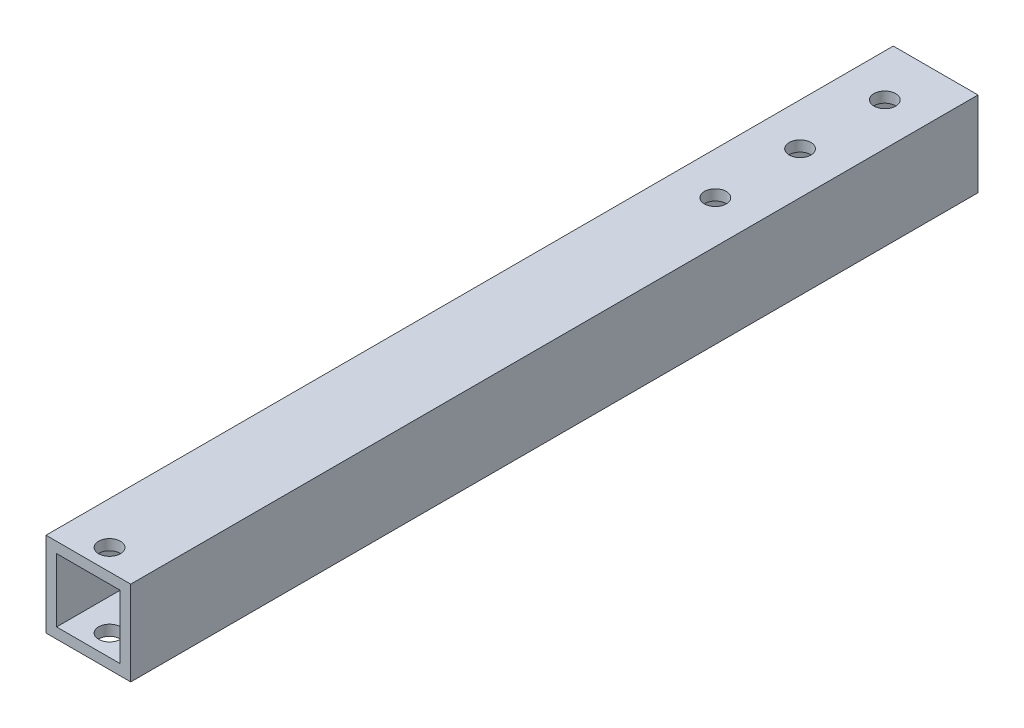
ISO-10303-21;
HEADER;
FILE_DESCRIPTION(('STEP AP214'),'2;1');
FILE_NAME('part.step','',(''),(''),'','','');
FILE_SCHEMA(('AUTOMOTIVE_DESIGN { 1 0 10303 214 1 1 1 1 }'));
ENDSEC;
DATA;
#1=APPLICATION_CONTEXT('core data for automotive mechanical design processes');
#2=APPLICATION_PROTOCOL_DEFINITION('international standard','automotive_design',2000,#1);
#3=PRODUCT_CONTEXT('',#1,'mechanical');
#4=PRODUCT('Part','Part','',(#3));
#5=PRODUCT_RELATED_PRODUCT_CATEGORY('part','',(#4));
#6=PRODUCT_DEFINITION_FORMATION('','',#4);
#7=PRODUCT_DEFINITION_CONTEXT('part definition',#1,'design');
#8=PRODUCT_DEFINITION('design','',#6,#7);
#9=PRODUCT_DEFINITION_SHAPE('','',#8);
#10=(LENGTH_UNIT() NAMED_UNIT(*) SI_UNIT(.MILLI.,.METRE.));
#11=(NAMED_UNIT(*) PLANE_ANGLE_UNIT() SI_UNIT($,.RADIAN.));
#12=(NAMED_UNIT(*) SI_UNIT($,.STERADIAN.) SOLID_ANGLE_UNIT());
#13=UNCERTAINTY_MEASURE_WITH_UNIT(LENGTH_MEASURE(1.E-05),#10,'distance_accuracy_value','');
#14=(GEOMETRIC_REPRESENTATION_CONTEXT(3) GLOBAL_UNCERTAINTY_ASSIGNED_CONTEXT((#13)) GLOBAL_UNIT_ASSIGNED_CONTEXT((#10,
#11,#12)) REPRESENTATION_CONTEXT('',''));
#15=CARTESIAN_POINT('',(0.,0.,0.));
#16=DIRECTION('',(0.,0.,1.));
#17=DIRECTION('',(1.,0.,0.));
#18=AXIS2_PLACEMENT_3D('',#15,#16,#17);
#19=CARTESIAN_POINT('',(0.,0.,254.));
#20=DIRECTION('',(0.,0.,-1.));
#21=DIRECTION('',(-1.,0.,0.));
#22=AXIS2_PLACEMENT_3D('',#19,#20,#21);
#23=PLANE('',#22);
#24=DIRECTION('',(-1.,0.,0.));
#25=VECTOR('',#24,1.);
#26=CARTESIAN_POINT('',(12.7000000000001,-12.7,254.));
#27=LINE('',#26,#25);
#28=CARTESIAN_POINT('',(12.7000000000001,-12.7,254.));
#29=VERTEX_POINT('',#28);
#30=CARTESIAN_POINT('',(-12.6999999999999,-12.7,254.));
#31=VERTEX_POINT('',#30);
#32=EDGE_CURVE('E140',#29,#31,#27,.T.);
#33=ORIENTED_EDGE('',*,*,#32,.F.);
#34=DIRECTION('',(0.,1.,0.));
#35=VECTOR('',#34,1.);
#36=CARTESIAN_POINT('',(12.7000000000001,-12.7,254.));
#37=LINE('',#36,#35);
#38=CARTESIAN_POINT('',(12.7000000000001,12.7,254.));
#39=VERTEX_POINT('',#38);
#40=EDGE_CURVE('E149',#29,#39,#37,.T.);
#41=ORIENTED_EDGE('',*,*,#40,.T.);
#42=DIRECTION('',(-1.,0.,0.));
#43=VECTOR('',#42,1.);
#44=CARTESIAN_POINT('',(12.7000000000001,12.7,254.));
#45=LINE('',#44,#43);
#46=CARTESIAN_POINT('',(-12.6999999999999,12.7,254.));
#47=VERTEX_POINT('',#46);
#48=EDGE_CURVE('E147',#39,#47,#45,.T.);
#49=ORIENTED_EDGE('',*,*,#48,.T.);
#50=DIRECTION('',(0.,1.,0.));
#51=VECTOR('',#50,1.);
#52=CARTESIAN_POINT('',(-12.6999999999999,-12.7,254.));
#53=LINE('',#52,#51);
#54=EDGE_CURVE('E143',#31,#47,#53,.T.);
#55=ORIENTED_EDGE('',*,*,#54,.F.);
#56=EDGE_LOOP('',(#33,#41,#49,#55));
#57=FACE_BOUND('',#56,.T.);
#58=DIRECTION('',(0.,1.,0.));
#59=VECTOR('',#58,1.);
#60=CARTESIAN_POINT('',(9.52500000000005,-9.52499999999999,254.));
#61=LINE('',#60,#59);
#62=CARTESIAN_POINT('',(9.52500000000005,-9.52499999999999,254.));
#63=VERTEX_POINT('',#62);
#64=CARTESIAN_POINT('',(9.52500000000005,9.52499999999999,254.));
#65=VERTEX_POINT('',#64);
#66=EDGE_CURVE('E102',#63,#65,#61,.T.);
#67=ORIENTED_EDGE('',*,*,#66,.F.);
#68=DIRECTION('',(1.,0.,0.));
#69=VECTOR('',#68,1.);
#70=CARTESIAN_POINT('',(-9.52500000000006,-9.52499999999999,254.));
#71=LINE('',#70,#69);
#72=CARTESIAN_POINT('',(-9.52500000000006,-9.52499999999999,254.));
#73=VERTEX_POINT('',#72);
#74=EDGE_CURVE('E124',#73,#63,#71,.T.);
#75=ORIENTED_EDGE('',*,*,#74,.F.);
#76=DIRECTION('',(0.,-1.,0.));
#77=VECTOR('',#76,1.);
#78=CARTESIAN_POINT('',(-9.52500000000006,-9.52499999999999,254.));
#79=LINE('',#78,#77);
#80=CARTESIAN_POINT('',(-9.52500000000006,9.52499999999999,254.));
#81=VERTEX_POINT('',#80);
#82=EDGE_CURVE('E122',#81,#73,#79,.T.);
#83=ORIENTED_EDGE('',*,*,#82,.F.);
#84=DIRECTION('',(-1.,0.,0.));
#85=VECTOR('',#84,1.);
#86=CARTESIAN_POINT('',(-9.52500000000006,9.52499999999999,254.));
#87=LINE('',#86,#85);
#88=EDGE_CURVE('E110',#65,#81,#87,.T.);
#89=ORIENTED_EDGE('',*,*,#88,.F.);
#90=EDGE_LOOP('',(#67,#75,#83,#89));
#91=FACE_BOUND('',#90,.T.);
#92=ADVANCED_FACE('F36',(#57,#91),#23,.F.);
#93=CARTESIAN_POINT('',(0.,0.,0.));
#94=DIRECTION('',(0.,0.,-1.));
#95=DIRECTION('',(-1.,0.,0.));
#96=AXIS2_PLACEMENT_3D('',#93,#94,#95);
#97=PLANE('',#96);
#98=DIRECTION('',(-1.,0.,0.));
#99=VECTOR('',#98,1.);
#100=CARTESIAN_POINT('',(12.7000000000001,-12.7,0.));
#101=LINE('',#100,#99);
#102=CARTESIAN_POINT('',(12.7000000000001,-12.7,0.));
#103=VERTEX_POINT('',#102);
#104=CARTESIAN_POINT('',(-12.6999999999999,-12.7,0.));
#105=VERTEX_POINT('',#104);
#106=EDGE_CURVE('E118',#103,#105,#101,.T.);
#107=ORIENTED_EDGE('',*,*,#106,.T.);
#108=DIRECTION('',(0.,1.,0.));
#109=VECTOR('',#108,1.);
#110=CARTESIAN_POINT('',(-12.6999999999999,-12.7,0.));
#111=LINE('',#110,#109);
#112=CARTESIAN_POINT('',(-12.6999999999999,12.7,0.));
#113=VERTEX_POINT('',#112);
#114=EDGE_CURVE('E154',#105,#113,#111,.T.);
#115=ORIENTED_EDGE('',*,*,#114,.T.);
#116=DIRECTION('',(-1.,0.,0.));
#117=VECTOR('',#116,1.);
#118=CARTESIAN_POINT('',(12.7000000000001,12.7,0.));
#119=LINE('',#118,#117);
#120=CARTESIAN_POINT('',(12.7000000000001,12.7,0.));
#121=VERTEX_POINT('',#120);
#122=EDGE_CURVE('E157',#121,#113,#119,.T.);
#123=ORIENTED_EDGE('',*,*,#122,.F.);
#124=DIRECTION('',(0.,1.,0.));
#125=VECTOR('',#124,1.);
#126=CARTESIAN_POINT('',(12.7000000000001,-12.7,0.));
#127=LINE('',#126,#125);
#128=EDGE_CURVE('E144',#103,#121,#127,.T.);
#129=ORIENTED_EDGE('',*,*,#128,.F.);
#130=EDGE_LOOP('',(#107,#115,#123,#129));
#131=FACE_BOUND('',#130,.T.);
#132=DIRECTION('',(1.,0.,0.));
#133=VECTOR('',#132,1.);
#134=CARTESIAN_POINT('',(-9.52500000000006,-9.52499999999999,0.));
#135=LINE('',#134,#133);
#136=CARTESIAN_POINT('',(-9.52500000000006,-9.52499999999999,0.));
#137=VERTEX_POINT('',#136);
#138=CARTESIAN_POINT('',(9.52500000000005,-9.52499999999999,0.));
#139=VERTEX_POINT('',#138);
#140=EDGE_CURVE('E111',#137,#139,#135,.T.);
#141=ORIENTED_EDGE('',*,*,#140,.T.);
#142=DIRECTION('',(0.,1.,0.));
#143=VECTOR('',#142,1.);
#144=CARTESIAN_POINT('',(9.52500000000005,-9.52499999999999,0.));
#145=LINE('',#144,#143);
#146=CARTESIAN_POINT('',(9.52500000000005,9.52499999999999,0.));
#147=VERTEX_POINT('',#146);
#148=EDGE_CURVE('E61',#139,#147,#145,.T.);
#149=ORIENTED_EDGE('',*,*,#148,.T.);
#150=DIRECTION('',(-1.,0.,0.));
#151=VECTOR('',#150,1.);
#152=CARTESIAN_POINT('',(-9.52500000000006,9.52499999999999,0.));
#153=LINE('',#152,#151);
#154=CARTESIAN_POINT('',(-9.52500000000006,9.52499999999999,0.));
#155=VERTEX_POINT('',#154);
#156=EDGE_CURVE('E117',#147,#155,#153,.T.);
#157=ORIENTED_EDGE('',*,*,#156,.T.);
#158=DIRECTION('',(0.,-1.,0.));
#159=VECTOR('',#158,1.);
#160=CARTESIAN_POINT('',(-9.52500000000006,-9.52499999999999,0.));
#161=LINE('',#160,#159);
#162=EDGE_CURVE('E132',#155,#137,#161,.T.);
#163=ORIENTED_EDGE('',*,*,#162,.T.);
#164=EDGE_LOOP('',(#141,#149,#157,#163));
#165=FACE_BOUND('',#164,.T.);
#166=ADVANCED_FACE('F219',(#131,#165),#97,.T.);
#167=CARTESIAN_POINT('',(12.7000000000001,-12.7,254.));
#168=DIRECTION('',(0.,-1.,0.));
#169=DIRECTION('',(0.,0.,-1.));
#170=AXIS2_PLACEMENT_3D('',#167,#168,#169);
#171=PLANE('',#170);
#172=CARTESIAN_POINT('',(0.,-12.7,66.04));
#173=DIRECTION('',(0.,1.,0.));
#174=DIRECTION('',(0.,0.,1.));
#175=AXIS2_PLACEMENT_3D('',#172,#173,#174);
#176=CIRCLE('',#175,3.26389999999999);
#177=CARTESIAN_POINT('',(0.,-12.7,69.3039));
#178=VERTEX_POINT('',#177);
#179=EDGE_CURVE('E178',#178,#178,#176,.T.);
#180=ORIENTED_EDGE('',*,*,#179,.T.);
#181=EDGE_LOOP('',(#180));
#182=FACE_BOUND('',#181,.T.);
#183=CARTESIAN_POINT('',(0.,-12.7,40.64));
#184=DIRECTION('',(0.,1.,0.));
#185=DIRECTION('',(0.,0.,1.));
#186=AXIS2_PLACEMENT_3D('',#183,#184,#185);
#187=CIRCLE('',#186,3.2639);
#188=CARTESIAN_POINT('',(0.,-12.7,43.9039));
#189=VERTEX_POINT('',#188);
#190=EDGE_CURVE('E189',#189,#189,#187,.T.);
#191=ORIENTED_EDGE('',*,*,#190,.T.);
#192=EDGE_LOOP('',(#191));
#193=FACE_BOUND('',#192,.T.);
#194=CARTESIAN_POINT('',(0.,-12.7,247.65));
#195=DIRECTION('',(0.,1.,0.));
#196=DIRECTION('',(0.,0.,1.));
#197=AXIS2_PLACEMENT_3D('',#194,#195,#196);
#198=CIRCLE('',#197,3.2639);
#199=CARTESIAN_POINT('',(0.,-12.7,250.9139));
#200=VERTEX_POINT('',#199);
#201=EDGE_CURVE('E174',#200,#200,#198,.T.);
#202=ORIENTED_EDGE('',*,*,#201,.T.);
#203=EDGE_LOOP('',(#202));
#204=FACE_BOUND('',#203,.T.);
#205=CARTESIAN_POINT('',(0.,-12.7,15.24));
#206=DIRECTION('',(0.,-1.,0.));
#207=DIRECTION('',(0.,0.,-1.));
#208=AXIS2_PLACEMENT_3D('',#205,#206,#207);
#209=CIRCLE('',#208,3.2639);
#210=CARTESIAN_POINT('',(0.,-12.7,18.5039));
#211=VERTEX_POINT('',#210);
#212=EDGE_CURVE('E130',#211,#211,#209,.T.);
#213=ORIENTED_EDGE('',*,*,#212,.F.);
#214=EDGE_LOOP('',(#213));
#215=FACE_BOUND('',#214,.T.);
#216=ORIENTED_EDGE('',*,*,#106,.F.);
#217=DIRECTION('',(0.,0.,-1.));
#218=VECTOR('',#217,1.);
#219=CARTESIAN_POINT('',(12.7000000000001,-12.7,254.));
#220=LINE('',#219,#218);
#221=EDGE_CURVE('E11',#29,#103,#220,.T.);
#222=ORIENTED_EDGE('',*,*,#221,.F.);
#223=ORIENTED_EDGE('',*,*,#32,.T.);
#224=DIRECTION('',(0.,0.,-1.));
#225=VECTOR('',#224,1.);
#226=CARTESIAN_POINT('',(-12.6999999999999,-12.7,254.));
#227=LINE('',#226,#225);
#228=EDGE_CURVE('E151',#31,#105,#227,.T.);
#229=ORIENTED_EDGE('',*,*,#228,.T.);
#230=EDGE_LOOP('',(#216,#222,#223,#229));
#231=FACE_BOUND('',#230,.T.);
#232=ADVANCED_FACE('F38',(#182,#193,#204,#215,#231),#171,.T.);
#233=CARTESIAN_POINT('',(12.7000000000001,-12.7,254.));
#234=DIRECTION('',(-1.,0.,0.));
#235=DIRECTION('',(0.,0.,1.));
#236=AXIS2_PLACEMENT_3D('',#233,#234,#235);
#237=PLANE('',#236);
#238=ORIENTED_EDGE('',*,*,#128,.T.);
#239=DIRECTION('',(0.,0.,-1.));
#240=VECTOR('',#239,1.);
#241=CARTESIAN_POINT('',(12.7000000000001,12.7,254.));
#242=LINE('',#241,#240);
#243=EDGE_CURVE('E45',#39,#121,#242,.T.);
#244=ORIENTED_EDGE('',*,*,#243,.F.);
#245=ORIENTED_EDGE('',*,*,#40,.F.);
#246=ORIENTED_EDGE('',*,*,#221,.T.);
#247=EDGE_LOOP('',(#238,#244,#245,#246));
#248=FACE_BOUND('',#247,.T.);
#249=ADVANCED_FACE('F218',(#248),#237,.F.);
#250=CARTESIAN_POINT('',(12.7000000000001,12.7,254.));
#251=DIRECTION('',(0.,-1.,0.));
#252=DIRECTION('',(0.,0.,-1.));
#253=AXIS2_PLACEMENT_3D('',#250,#251,#252);
#254=PLANE('',#253);
#255=CARTESIAN_POINT('',(0.,12.7,66.04));
#256=DIRECTION('',(0.,1.,0.));
#257=DIRECTION('',(0.,0.,1.));
#258=AXIS2_PLACEMENT_3D('',#255,#256,#257);
#259=CIRCLE('',#258,3.26389999999999);
#260=CARTESIAN_POINT('',(0.,12.7,69.3039));
#261=VERTEX_POINT('',#260);
#262=EDGE_CURVE('E184',#261,#261,#259,.T.);
#263=ORIENTED_EDGE('',*,*,#262,.F.);
#264=EDGE_LOOP('',(#263));
#265=FACE_BOUND('',#264,.T.);
#266=CARTESIAN_POINT('',(0.,12.7,40.64));
#267=DIRECTION('',(0.,1.,0.));
#268=DIRECTION('',(0.,0.,1.));
#269=AXIS2_PLACEMENT_3D('',#266,#267,#268);
#270=CIRCLE('',#269,3.2639);
#271=CARTESIAN_POINT('',(0.,12.7,43.9039));
#272=VERTEX_POINT('',#271);
#273=EDGE_CURVE('E194',#272,#272,#270,.T.);
#274=ORIENTED_EDGE('',*,*,#273,.F.);
#275=EDGE_LOOP('',(#274));
#276=FACE_BOUND('',#275,.T.);
#277=CARTESIAN_POINT('',(0.,12.7,247.65));
#278=DIRECTION('',(0.,1.,0.));
#279=DIRECTION('',(0.,0.,1.));
#280=AXIS2_PLACEMENT_3D('',#277,#278,#279);
#281=CIRCLE('',#280,3.2639);
#282=CARTESIAN_POINT('',(0.,12.7,250.9139));
#283=VERTEX_POINT('',#282);
#284=EDGE_CURVE('E200',#283,#283,#281,.T.);
#285=ORIENTED_EDGE('',*,*,#284,.F.);
#286=EDGE_LOOP('',(#285));
#287=FACE_BOUND('',#286,.T.);
#288=CARTESIAN_POINT('',(0.,12.7,15.24));
#289=DIRECTION('',(0.,1.,0.));
#290=DIRECTION('',(0.,0.,1.));
#291=AXIS2_PLACEMENT_3D('',#288,#289,#290);
#292=CIRCLE('',#291,3.2639);
#293=CARTESIAN_POINT('',(0.,12.7,18.5039));
#294=VERTEX_POINT('',#293);
#295=EDGE_CURVE('E170',#294,#294,#292,.T.);
#296=ORIENTED_EDGE('',*,*,#295,.F.);
#297=EDGE_LOOP('',(#296));
#298=FACE_BOUND('',#297,.T.);
#299=ORIENTED_EDGE('',*,*,#122,.T.);
#300=DIRECTION('',(0.,0.,-1.));
#301=VECTOR('',#300,1.);
#302=CARTESIAN_POINT('',(-12.6999999999999,12.7,254.));
#303=LINE('',#302,#301);
#304=EDGE_CURVE('E163',#47,#113,#303,.T.);
#305=ORIENTED_EDGE('',*,*,#304,.F.);
#306=ORIENTED_EDGE('',*,*,#48,.F.);
#307=ORIENTED_EDGE('',*,*,#243,.T.);
#308=EDGE_LOOP('',(#299,#305,#306,#307));
#309=FACE_BOUND('',#308,.T.);
#310=ADVANCED_FACE('F231',(#265,#276,#287,#298,#309),#254,.F.);
#311=CARTESIAN_POINT('',(-12.6999999999999,-12.7,254.));
#312=DIRECTION('',(-1.,0.,0.));
#313=DIRECTION('',(0.,0.,1.));
#314=AXIS2_PLACEMENT_3D('',#311,#312,#313);
#315=PLANE('',#314);
#316=ORIENTED_EDGE('',*,*,#114,.F.);
#317=ORIENTED_EDGE('',*,*,#228,.F.);
#318=ORIENTED_EDGE('',*,*,#54,.T.);
#319=ORIENTED_EDGE('',*,*,#304,.T.);
#320=EDGE_LOOP('',(#316,#317,#318,#319));
#321=FACE_BOUND('',#320,.T.);
#322=ADVANCED_FACE('F237',(#321),#315,.T.);
#323=CARTESIAN_POINT('',(9.52500000000005,-9.52499999999999,254.));
#324=DIRECTION('',(-1.,0.,0.));
#325=DIRECTION('',(0.,0.,1.));
#326=AXIS2_PLACEMENT_3D('',#323,#324,#325);
#327=PLANE('',#326);
#328=ORIENTED_EDGE('',*,*,#148,.F.);
#329=DIRECTION('',(0.,0.,-1.));
#330=VECTOR('',#329,1.);
#331=CARTESIAN_POINT('',(9.52500000000005,-9.52499999999999,254.));
#332=LINE('',#331,#330);
#333=EDGE_CURVE('E106',#63,#139,#332,.T.);
#334=ORIENTED_EDGE('',*,*,#333,.F.);
#335=ORIENTED_EDGE('',*,*,#66,.T.);
#336=DIRECTION('',(0.,0.,-1.));
#337=VECTOR('',#336,1.);
#338=CARTESIAN_POINT('',(9.52500000000005,9.52499999999999,254.));
#339=LINE('',#338,#337);
#340=EDGE_CURVE('E105',#65,#147,#339,.T.);
#341=ORIENTED_EDGE('',*,*,#340,.T.);
#342=EDGE_LOOP('',(#328,#334,#335,#341));
#343=FACE_BOUND('',#342,.T.);
#344=ADVANCED_FACE('F104',(#343),#327,.T.);
#345=CARTESIAN_POINT('',(-9.52500000000006,9.52499999999999,254.));
#346=DIRECTION('',(0.,-1.,0.));
#347=DIRECTION('',(0.,0.,-1.));
#348=AXIS2_PLACEMENT_3D('',#345,#346,#347);
#349=PLANE('',#348);
#350=CARTESIAN_POINT('',(0.,9.52499999999999,66.04));
#351=DIRECTION('',(0.,-1.,0.));
#352=DIRECTION('',(0.,0.,-1.));
#353=AXIS2_PLACEMENT_3D('',#350,#351,#352);
#354=CIRCLE('',#353,3.26389999999999);
#355=CARTESIAN_POINT('',(0.,9.52499999999999,62.7761));
#356=VERTEX_POINT('',#355);
#357=EDGE_CURVE('E197',#356,#356,#354,.T.);
#358=ORIENTED_EDGE('',*,*,#357,.F.);
#359=EDGE_LOOP('',(#358));
#360=FACE_BOUND('',#359,.T.);
#361=CARTESIAN_POINT('',(0.,9.52499999999999,40.64));
#362=DIRECTION('',(0.,-1.,0.));
#363=DIRECTION('',(0.,0.,-1.));
#364=AXIS2_PLACEMENT_3D('',#361,#362,#363);
#365=CIRCLE('',#364,3.2639);
#366=CARTESIAN_POINT('',(0.,9.52499999999999,37.3761));
#367=VERTEX_POINT('',#366);
#368=EDGE_CURVE('E177',#367,#367,#365,.T.);
#369=ORIENTED_EDGE('',*,*,#368,.F.);
#370=EDGE_LOOP('',(#369));
#371=FACE_BOUND('',#370,.T.);
#372=CARTESIAN_POINT('',(0.,9.52499999999999,247.65));
#373=DIRECTION('',(0.,-1.,0.));
#374=DIRECTION('',(0.,0.,-1.));
#375=AXIS2_PLACEMENT_3D('',#372,#373,#374);
#376=CIRCLE('',#375,3.2639);
#377=CARTESIAN_POINT('',(0.,9.52499999999999,244.3861));
#378=VERTEX_POINT('',#377);
#379=EDGE_CURVE('E173',#378,#378,#376,.T.);
#380=ORIENTED_EDGE('',*,*,#379,.F.);
#381=EDGE_LOOP('',(#380));
#382=FACE_BOUND('',#381,.T.);
#383=CARTESIAN_POINT('',(0.,9.52500000000001,15.24));
#384=DIRECTION('',(0.,-1.,0.));
#385=DIRECTION('',(0.,0.,-1.));
#386=AXIS2_PLACEMENT_3D('',#383,#384,#385);
#387=CIRCLE('',#386,3.2639);
#388=CARTESIAN_POINT('',(0.,9.52500000000006,18.5039));
#389=VERTEX_POINT('',#388);
#390=EDGE_CURVE('E169',#389,#389,#387,.T.);
#391=ORIENTED_EDGE('',*,*,#390,.F.);
#392=EDGE_LOOP('',(#391));
#393=FACE_BOUND('',#392,.T.);
#394=ORIENTED_EDGE('',*,*,#156,.F.);
#395=ORIENTED_EDGE('',*,*,#340,.F.);
#396=ORIENTED_EDGE('',*,*,#88,.T.);
#397=DIRECTION('',(0.,0.,-1.));
#398=VECTOR('',#397,1.);
#399=CARTESIAN_POINT('',(-9.52500000000006,9.52499999999999,254.));
#400=LINE('',#399,#398);
#401=EDGE_CURVE('E119',#81,#155,#400,.T.);
#402=ORIENTED_EDGE('',*,*,#401,.T.);
#403=EDGE_LOOP('',(#394,#395,#396,#402));
#404=FACE_BOUND('',#403,.T.);
#405=ADVANCED_FACE('F114',(#360,#371,#382,#393,#404),#349,.T.);
#406=CARTESIAN_POINT('',(-9.52500000000006,-9.52499999999999,254.));
#407=DIRECTION('',(1.,0.,0.));
#408=DIRECTION('',(0.,0.,-1.));
#409=AXIS2_PLACEMENT_3D('',#406,#407,#408);
#410=PLANE('',#409);
#411=ORIENTED_EDGE('',*,*,#162,.F.);
#412=ORIENTED_EDGE('',*,*,#401,.F.);
#413=ORIENTED_EDGE('',*,*,#82,.T.);
#414=DIRECTION('',(0.,0.,-1.));
#415=VECTOR('',#414,1.);
#416=CARTESIAN_POINT('',(-9.52500000000006,-9.52499999999999,254.));
#417=LINE('',#416,#415);
#418=EDGE_CURVE('E53',#73,#137,#417,.T.);
#419=ORIENTED_EDGE('',*,*,#418,.T.);
#420=EDGE_LOOP('',(#411,#412,#413,#419));
#421=FACE_BOUND('',#420,.T.);
#422=ADVANCED_FACE('F276',(#421),#410,.T.);
#423=CARTESIAN_POINT('',(-9.52500000000006,-9.52499999999999,254.));
#424=DIRECTION('',(0.,1.,0.));
#425=DIRECTION('',(0.,0.,1.));
#426=AXIS2_PLACEMENT_3D('',#423,#424,#425);
#427=PLANE('',#426);
#428=CARTESIAN_POINT('',(0.,-9.52499999999999,66.04));
#429=DIRECTION('',(0.,1.,0.));
#430=DIRECTION('',(0.,0.,1.));
#431=AXIS2_PLACEMENT_3D('',#428,#429,#430);
#432=CIRCLE('',#431,3.26389999999999);
#433=CARTESIAN_POINT('',(0.,-9.52499999999999,69.3039));
#434=VERTEX_POINT('',#433);
#435=EDGE_CURVE('E40',#434,#434,#432,.T.);
#436=ORIENTED_EDGE('',*,*,#435,.F.);
#437=EDGE_LOOP('',(#436));
#438=FACE_BOUND('',#437,.T.);
#439=CARTESIAN_POINT('',(0.,-9.52499999999999,40.64));
#440=DIRECTION('',(0.,1.,0.));
#441=DIRECTION('',(0.,0.,1.));
#442=AXIS2_PLACEMENT_3D('',#439,#440,#441);
#443=CIRCLE('',#442,3.2639);
#444=CARTESIAN_POINT('',(0.,-9.52499999999999,43.9039));
#445=VERTEX_POINT('',#444);
#446=EDGE_CURVE('E175',#445,#445,#443,.T.);
#447=ORIENTED_EDGE('',*,*,#446,.F.);
#448=EDGE_LOOP('',(#447));
#449=FACE_BOUND('',#448,.T.);
#450=CARTESIAN_POINT('',(0.,-9.52499999999999,247.65));
#451=DIRECTION('',(0.,1.,0.));
#452=DIRECTION('',(0.,0.,1.));
#453=AXIS2_PLACEMENT_3D('',#450,#451,#452);
#454=CIRCLE('',#453,3.2639);
#455=CARTESIAN_POINT('',(0.,-9.52499999999999,250.9139));
#456=VERTEX_POINT('',#455);
#457=EDGE_CURVE('E171',#456,#456,#454,.T.);
#458=ORIENTED_EDGE('',*,*,#457,.F.);
#459=EDGE_LOOP('',(#458));
#460=FACE_BOUND('',#459,.T.);
#461=CARTESIAN_POINT('',(0.,-9.52500000000001,15.24));
#462=DIRECTION('',(0.,1.,0.));
#463=DIRECTION('',(0.,0.,1.));
#464=AXIS2_PLACEMENT_3D('',#461,#462,#463);
#465=CIRCLE('',#464,3.2639);
#466=CARTESIAN_POINT('',(0.,-9.52500000000006,18.5039));
#467=VERTEX_POINT('',#466);
#468=EDGE_CURVE('E166',#467,#467,#465,.T.);
#469=ORIENTED_EDGE('',*,*,#468,.F.);
#470=EDGE_LOOP('',(#469));
#471=FACE_BOUND('',#470,.T.);
#472=ORIENTED_EDGE('',*,*,#140,.F.);
#473=ORIENTED_EDGE('',*,*,#418,.F.);
#474=ORIENTED_EDGE('',*,*,#74,.T.);
#475=ORIENTED_EDGE('',*,*,#333,.T.);
#476=EDGE_LOOP('',(#472,#473,#474,#475));
#477=FACE_BOUND('',#476,.T.);
#478=ADVANCED_FACE('F284',(#438,#449,#460,#471,#477),#427,.T.);
#479=CARTESIAN_POINT('',(0.,-292.1,15.24));
#480=DIRECTION('',(0.,1.,0.));
#481=DIRECTION('',(0.,0.,1.));
#482=AXIS2_PLACEMENT_3D('',#479,#480,#481);
#483=CYLINDRICAL_SURFACE('',#482,3.2639);
#484=CARTESIAN_POINT('',(0.,-12.7,18.5039));
#485=CARTESIAN_POINT('',(0.,-12.6669270833333,18.5039));
#486=CARTESIAN_POINT('',(0.,-12.6338541666666,18.5039));
#487=CARTESIAN_POINT('',(0.,-12.5677083333333,18.5039));
#488=CARTESIAN_POINT('',(0.,-12.5346354166667,18.5039));
#489=CARTESIAN_POINT('',(0.,-12.4684895833333,18.5039));
#490=CARTESIAN_POINT('',(0.,-12.4354166666667,18.5039));
#491=CARTESIAN_POINT('',(0.,-12.3692708333333,18.5039));
#492=CARTESIAN_POINT('',(0.,-12.3361979166667,18.5039));
#493=CARTESIAN_POINT('',(0.,-12.2700520833334,18.5039));
#494=CARTESIAN_POINT('',(0.,-12.2369791666667,18.5039));
#495=CARTESIAN_POINT('',(0.,-12.1708333333333,18.5039));
#496=CARTESIAN_POINT('',(0.,-12.1377604166667,18.5039));
#497=CARTESIAN_POINT('',(0.,-12.0716145833333,18.5039));
#498=CARTESIAN_POINT('',(0.,-12.0385416666667,18.5039));
#499=CARTESIAN_POINT('',(0.,-11.9723958333334,18.5039));
#500=CARTESIAN_POINT('',(0.,-11.9393229166667,18.5039));
#501=CARTESIAN_POINT('',(0.,-11.8731770833333,18.5039));
#502=CARTESIAN_POINT('',(0.,-11.8401041666667,18.5039));
#503=CARTESIAN_POINT('',(0.,-11.7739583333333,18.5039));
#504=CARTESIAN_POINT('',(0.,-11.7408854166667,18.5039));
#505=CARTESIAN_POINT('',(0.,-11.6747395833334,18.5039));
#506=CARTESIAN_POINT('',(0.,-11.6416666666667,18.5039));
#507=CARTESIAN_POINT('',(0.,-11.5755208333333,18.5039));
#508=CARTESIAN_POINT('',(0.,-11.5424479166667,18.5039));
#509=CARTESIAN_POINT('',(0.,-11.4763020833333,18.5039));
#510=CARTESIAN_POINT('',(0.,-11.4432291666667,18.5039));
#511=CARTESIAN_POINT('',(0.,-11.3770833333334,18.5039));
#512=CARTESIAN_POINT('',(0.,-11.3440104166667,18.5039));
#513=CARTESIAN_POINT('',(0.,-11.2778645833334,18.5039));
#514=CARTESIAN_POINT('',(0.,-11.2447916666667,18.5039));
#515=CARTESIAN_POINT('',(0.,-11.1786458333334,18.5039));
#516=CARTESIAN_POINT('',(0.,-11.1455729166667,18.5039));
#517=CARTESIAN_POINT('',(0.,-11.0794270833334,18.5039));
#518=CARTESIAN_POINT('',(0.,-11.0463541666667,18.5039));
#519=CARTESIAN_POINT('',(0.,-10.9802083333334,18.5039));
#520=CARTESIAN_POINT('',(0.,-10.9471354166667,18.5039));
#521=CARTESIAN_POINT('',(0.,-10.8809895833334,18.5039));
#522=CARTESIAN_POINT('',(0.,-10.8479166666667,18.5039));
#523=CARTESIAN_POINT('',(0.,-10.7817708333334,18.5039));
#524=CARTESIAN_POINT('',(0.,-10.7486979166667,18.5039));
#525=CARTESIAN_POINT('',(0.,-10.6825520833334,18.5039));
#526=CARTESIAN_POINT('',(0.,-10.6494791666667,18.5039));
#527=CARTESIAN_POINT('',(0.,-10.5833333333334,18.5039));
#528=CARTESIAN_POINT('',(0.,-10.5502604166667,18.5039));
#529=CARTESIAN_POINT('',(0.,-10.4841145833334,18.5039));
#530=CARTESIAN_POINT('',(0.,-10.4510416666667,18.5039));
#531=CARTESIAN_POINT('',(0.,-10.3848958333334,18.5039));
#532=CARTESIAN_POINT('',(0.,-10.3518229166667,18.5039));
#533=CARTESIAN_POINT('',(0.,-10.2856770833334,18.5039));
#534=CARTESIAN_POINT('',(0.,-10.2526041666667,18.5039));
#535=CARTESIAN_POINT('',(0.,-10.1864583333334,18.5039));
#536=CARTESIAN_POINT('',(0.,-10.1533854166667,18.5039));
#537=CARTESIAN_POINT('',(0.,-10.0872395833334,18.5039));
#538=CARTESIAN_POINT('',(0.,-10.0541666666667,18.5039));
#539=CARTESIAN_POINT('',(0.,-9.98802083333337,18.5039));
#540=CARTESIAN_POINT('',(0.,-9.9549479166667,18.5039));
#541=CARTESIAN_POINT('',(0.,-9.88880208333337,18.5039));
#542=CARTESIAN_POINT('',(0.,-9.85572916666672,18.5039));
#543=CARTESIAN_POINT('',(0.,-9.78958333333339,18.5039));
#544=CARTESIAN_POINT('',(0.,-9.75651041666672,18.5039));
#545=CARTESIAN_POINT('',(0.,-9.69036458333339,18.5039));
#546=CARTESIAN_POINT('',(0.,-9.65729166666673,18.5039));
#547=CARTESIAN_POINT('',(0.,-9.59114583333341,18.5039));
#548=CARTESIAN_POINT('',(0.,-9.55807291666673,18.5039));
#549=CARTESIAN_POINT('',(0.,-9.52500000000006,18.5039));
#550=B_SPLINE_CURVE_WITH_KNOTS('',3,(#484,#485,#486,#487,#488,#489,#490,#491,#492,#493,#494,
#495,#496,#497,#498,#499,#500,#501,#502,#503,#504,#505,#506,#507,#508,#509,#510,#511,#512,#513,
#514,#515,#516,#517,#518,#519,#520,#521,#522,#523,#524,#525,#526,#527,#528,#529,#530,#531,#532,
#533,#534,#535,#536,#537,#538,#539,#540,#541,#542,#543,#544,#545,#546,#547,#548,#549),
.UNSPECIFIED.,.F.,.F.,(4,2,2,2,2,2,2,2,2,2,2,2,2,2,2,2,2,2,2,2,2,2,2,2,2,2,2,2,2,2,2,2,4),(0.,
0.0992187500000186,0.198437499999982,0.29765625,0.396874999999963,0.496093749999982,0.5953125,
0.694531249999963,0.793749999999982,0.892968750000001,0.992187499999964,1.09140624999998,
1.190625,1.28984374999996,1.38906249999998,1.48828124999995,1.58749999999996,1.68671874999998,
1.78593749999995,1.88515624999996,1.98437499999993,2.08359374999995,2.18281249999996,
2.28203124999993,2.38124999999995,2.48046874999996,2.57968749999993,2.67890624999995,
2.77812499999996,2.87734374999993,2.97656249999995,3.07578124999991,3.17499999999993),.UNSPECIFIED.);
#551=EDGE_CURVE('BSEAM213',#211,#467,#550,.T.);
#552=ORIENTED_EDGE('',*,*,#212,.T.);
#553=ORIENTED_EDGE('',*,*,#468,.T.);
#554=ORIENTED_EDGE('',*,*,#551,.T.);
#555=ORIENTED_EDGE('',*,*,#551,.F.);
#556=EDGE_LOOP('',(#552,#554,#553,#555));
#557=FACE_BOUND('',#556,.T.);
#558=ADVANCED_FACE('F213',(#557),#483,.F.);
#559=CARTESIAN_POINT('',(0.,9.52500000000006,18.5039));
#560=CARTESIAN_POINT('',(0.,9.55807291666673,18.5039));
#561=CARTESIAN_POINT('',(0.,9.59114583333341,18.5039));
#562=CARTESIAN_POINT('',(0.,9.65729166666673,18.5039));
#563=CARTESIAN_POINT('',(0.,9.69036458333339,18.5039));
#564=CARTESIAN_POINT('',(0.,9.75651041666672,18.5039));
#565=CARTESIAN_POINT('',(0.,9.78958333333339,18.5039));
#566=CARTESIAN_POINT('',(0.,9.85572916666672,18.5039));
#567=CARTESIAN_POINT('',(0.,9.88880208333337,18.5039));
#568=CARTESIAN_POINT('',(0.,9.9549479166667,18.5039));
#569=CARTESIAN_POINT('',(0.,9.98802083333337,18.5039));
#570=CARTESIAN_POINT('',(0.,10.0541666666667,18.5039));
#571=CARTESIAN_POINT('',(0.,10.0872395833334,18.5039));
#572=CARTESIAN_POINT('',(0.,10.1533854166667,18.5039));
#573=CARTESIAN_POINT('',(0.,10.1864583333334,18.5039));
#574=CARTESIAN_POINT('',(0.,10.2526041666667,18.5039));
#575=CARTESIAN_POINT('',(0.,10.2856770833334,18.5039));
#576=CARTESIAN_POINT('',(0.,10.3518229166667,18.5039));
#577=CARTESIAN_POINT('',(0.,10.3848958333334,18.5039));
#578=CARTESIAN_POINT('',(0.,10.4510416666667,18.5039));
#579=CARTESIAN_POINT('',(0.,10.4841145833334,18.5039));
#580=CARTESIAN_POINT('',(0.,10.5502604166667,18.5039));
#581=CARTESIAN_POINT('',(0.,10.5833333333334,18.5039));
#582=CARTESIAN_POINT('',(0.,10.6494791666667,18.5039));
#583=CARTESIAN_POINT('',(0.,10.6825520833334,18.5039));
#584=CARTESIAN_POINT('',(0.,10.7486979166667,18.5039));
#585=CARTESIAN_POINT('',(0.,10.7817708333334,18.5039));
#586=CARTESIAN_POINT('',(0.,10.8479166666667,18.5039));
#587=CARTESIAN_POINT('',(0.,10.8809895833334,18.5039));
#588=CARTESIAN_POINT('',(0.,10.9471354166667,18.5039));
#589=CARTESIAN_POINT('',(0.,10.9802083333334,18.5039));
#590=CARTESIAN_POINT('',(0.,11.0463541666667,18.5039));
#591=CARTESIAN_POINT('',(0.,11.0794270833334,18.5039));
#592=CARTESIAN_POINT('',(0.,11.1455729166667,18.5039));
#593=CARTESIAN_POINT('',(0.,11.1786458333334,18.5039));
#594=CARTESIAN_POINT('',(0.,11.2447916666667,18.5039));
#595=CARTESIAN_POINT('',(0.,11.2778645833334,18.5039));
#596=CARTESIAN_POINT('',(0.,11.3440104166667,18.5039));
#597=CARTESIAN_POINT('',(0.,11.3770833333334,18.5039));
#598=CARTESIAN_POINT('',(0.,11.4432291666667,18.5039));
#599=CARTESIAN_POINT('',(0.,11.4763020833333,18.5039));
#600=CARTESIAN_POINT('',(0.,11.5424479166667,18.5039));
#601=CARTESIAN_POINT('',(0.,11.5755208333333,18.5039));
#602=CARTESIAN_POINT('',(0.,11.6416666666667,18.5039));
#603=CARTESIAN_POINT('',(0.,11.6747395833334,18.5039));
#604=CARTESIAN_POINT('',(0.,11.7408854166667,18.5039));
#605=CARTESIAN_POINT('',(0.,11.7739583333333,18.5039));
#606=CARTESIAN_POINT('',(0.,11.8401041666667,18.5039));
#607=CARTESIAN_POINT('',(0.,11.8731770833333,18.5039));
#608=CARTESIAN_POINT('',(0.,11.9393229166667,18.5039));
#609=CARTESIAN_POINT('',(0.,11.9723958333334,18.5039));
#610=CARTESIAN_POINT('',(0.,12.0385416666667,18.5039));
#611=CARTESIAN_POINT('',(0.,12.0716145833333,18.5039));
#612=CARTESIAN_POINT('',(0.,12.1377604166667,18.5039));
#613=CARTESIAN_POINT('',(0.,12.1708333333333,18.5039));
#614=CARTESIAN_POINT('',(0.,12.2369791666667,18.5039));
#615=CARTESIAN_POINT('',(0.,12.2700520833334,18.5039));
#616=CARTESIAN_POINT('',(0.,12.3361979166667,18.5039));
#617=CARTESIAN_POINT('',(0.,12.3692708333333,18.5039));
#618=CARTESIAN_POINT('',(0.,12.4354166666667,18.5039));
#619=CARTESIAN_POINT('',(0.,12.4684895833333,18.5039));
#620=CARTESIAN_POINT('',(0.,12.5346354166667,18.5039));
#621=CARTESIAN_POINT('',(0.,12.5677083333333,18.5039));
#622=CARTESIAN_POINT('',(0.,12.6338541666666,18.5039));
#623=CARTESIAN_POINT('',(0.,12.6669270833333,18.5039));
#624=CARTESIAN_POINT('',(0.,12.7,18.5039));
#625=B_SPLINE_CURVE_WITH_KNOTS('',3,(#559,#560,#561,#562,#563,#564,#565,#566,#567,#568,#569,
#570,#571,#572,#573,#574,#575,#576,#577,#578,#579,#580,#581,#582,#583,#584,#585,#586,#587,#588,
#589,#590,#591,#592,#593,#594,#595,#596,#597,#598,#599,#600,#601,#602,#603,#604,#605,#606,#607,
#608,#609,#610,#611,#612,#613,#614,#615,#616,#617,#618,#619,#620,#621,#622,#623,#624),
.UNSPECIFIED.,.F.,.F.,(4,2,2,2,2,2,2,2,2,2,2,2,2,2,2,2,2,2,2,2,2,2,2,2,2,2,2,2,2,2,2,2,4),(0.,
0.0992187500000186,0.198437499999982,0.29765625,0.396874999999963,0.496093749999982,0.5953125,
0.694531249999963,0.793749999999982,0.892968750000001,0.992187499999964,1.09140624999998,
1.190625,1.28984374999996,1.38906249999998,1.48828124999995,1.58749999999996,1.68671874999998,
1.78593749999995,1.88515624999996,1.98437499999993,2.08359374999995,2.18281249999996,
2.28203124999993,2.38124999999995,2.48046874999996,2.57968749999993,2.67890624999995,
2.77812499999996,2.87734374999993,2.97656249999995,3.07578124999991,3.17499999999993),.UNSPECIFIED.);
#626=EDGE_CURVE('BSEAM340',#389,#294,#625,.T.);
#627=ORIENTED_EDGE('',*,*,#390,.T.);
#628=ORIENTED_EDGE('',*,*,#295,.T.);
#629=ORIENTED_EDGE('',*,*,#626,.T.);
#630=ORIENTED_EDGE('',*,*,#626,.F.);
#631=EDGE_LOOP('',(#627,#629,#628,#630));
#632=FACE_BOUND('',#631,.T.);
#633=ADVANCED_FACE('F340',(#632),#483,.F.);
#634=CARTESIAN_POINT('',(0.,-12.7,247.65));
#635=DIRECTION('',(0.,1.,0.));
#636=DIRECTION('',(0.,0.,1.));
#637=AXIS2_PLACEMENT_3D('',#634,#635,#636);
#638=CYLINDRICAL_SURFACE('',#637,3.2639);
#639=ORIENTED_EDGE('',*,*,#457,.T.);
#640=EDGE_LOOP('',(#639));
#641=FACE_BOUND('',#640,.T.);
#642=ORIENTED_EDGE('',*,*,#201,.F.);
#643=EDGE_LOOP('',(#642));
#644=FACE_BOUND('',#643,.T.);
#645=ADVANCED_FACE('F337',(#641,#644),#638,.F.);
#646=ORIENTED_EDGE('',*,*,#379,.T.);
#647=EDGE_LOOP('',(#646));
#648=FACE_BOUND('',#647,.T.);
#649=ORIENTED_EDGE('',*,*,#284,.T.);
#650=EDGE_LOOP('',(#649));
#651=FACE_BOUND('',#650,.T.);
#652=ADVANCED_FACE('F302',(#648,#651),#638,.F.);
#653=CARTESIAN_POINT('',(0.,-12.7,40.64));
#654=DIRECTION('',(0.,1.,0.));
#655=DIRECTION('',(0.,0.,1.));
#656=AXIS2_PLACEMENT_3D('',#653,#654,#655);
#657=CYLINDRICAL_SURFACE('',#656,3.2639);
#658=ORIENTED_EDGE('',*,*,#446,.T.);
#659=EDGE_LOOP('',(#658));
#660=FACE_BOUND('',#659,.T.);
#661=ORIENTED_EDGE('',*,*,#190,.F.);
#662=EDGE_LOOP('',(#661));
#663=FACE_BOUND('',#662,.T.);
#664=ADVANCED_FACE('F296',(#660,#663),#657,.F.);
#665=CARTESIAN_POINT('',(0.,-12.7,66.04));
#666=DIRECTION('',(0.,1.,0.));
#667=DIRECTION('',(0.,0.,1.));
#668=AXIS2_PLACEMENT_3D('',#665,#666,#667);
#669=CYLINDRICAL_SURFACE('',#668,3.26389999999999);
#670=ORIENTED_EDGE('',*,*,#435,.T.);
#671=EDGE_LOOP('',(#670));
#672=FACE_BOUND('',#671,.T.);
#673=ORIENTED_EDGE('',*,*,#179,.F.);
#674=EDGE_LOOP('',(#673));
#675=FACE_BOUND('',#674,.T.);
#676=ADVANCED_FACE('F301',(#672,#675),#669,.F.);
#677=ORIENTED_EDGE('',*,*,#368,.T.);
#678=EDGE_LOOP('',(#677));
#679=FACE_BOUND('',#678,.T.);
#680=ORIENTED_EDGE('',*,*,#273,.T.);
#681=EDGE_LOOP('',(#680));
#682=FACE_BOUND('',#681,.T.);
#683=ADVANCED_FACE('F304',(#679,#682),#657,.F.);
#684=ORIENTED_EDGE('',*,*,#357,.T.);
#685=EDGE_LOOP('',(#684));
#686=FACE_BOUND('',#685,.T.);
#687=ORIENTED_EDGE('',*,*,#262,.T.);
#688=EDGE_LOOP('',(#687));
#689=FACE_BOUND('',#688,.T.);
#690=ADVANCED_FACE('F316',(#686,#689),#669,.F.);
#691=CLOSED_SHELL('',(#92,#166,#232,#249,#310,#322,#344,#405,#422,#478,#558,#633,#645,#652,#664,
#676,#683,#690));
#692=MANIFOLD_SOLID_BREP('B2',#691);
#693=ADVANCED_BREP_SHAPE_REPRESENTATION('',(#18,#692),#14);
#694=SHAPE_DEFINITION_REPRESENTATION(#9,#693);
ENDSEC;
END-ISO-10303-21;
